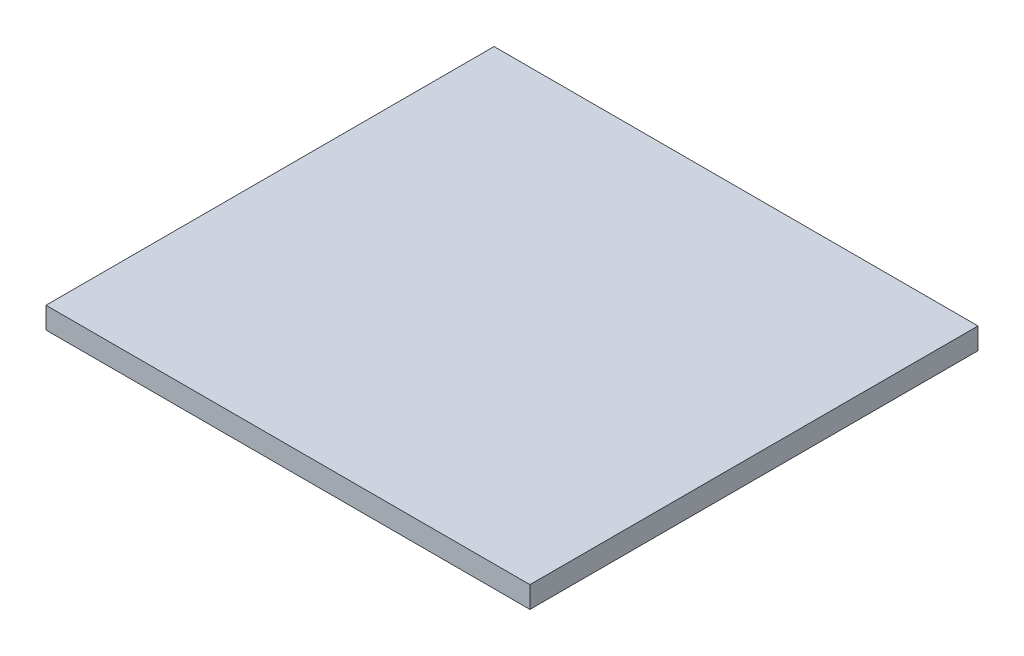
ISO-10303-21;
HEADER;
FILE_DESCRIPTION(('STEP AP214'),'2;1');
FILE_NAME('part.step','',(''),(''),'','','');
FILE_SCHEMA(('AUTOMOTIVE_DESIGN { 1 0 10303 214 1 1 1 1 }'));
ENDSEC;
DATA;
#1=APPLICATION_CONTEXT('core data for automotive mechanical design processes');
#2=APPLICATION_PROTOCOL_DEFINITION('international standard','automotive_design',2000,#1);
#3=PRODUCT_CONTEXT('',#1,'mechanical');
#4=PRODUCT('Part','Part','',(#3));
#5=PRODUCT_RELATED_PRODUCT_CATEGORY('part','',(#4));
#6=PRODUCT_DEFINITION_FORMATION('','',#4);
#7=PRODUCT_DEFINITION_CONTEXT('part definition',#1,'design');
#8=PRODUCT_DEFINITION('design','',#6,#7);
#9=PRODUCT_DEFINITION_SHAPE('','',#8);
#10=(LENGTH_UNIT() NAMED_UNIT(*) SI_UNIT(.MILLI.,.METRE.));
#11=(NAMED_UNIT(*) PLANE_ANGLE_UNIT() SI_UNIT($,.RADIAN.));
#12=(NAMED_UNIT(*) SI_UNIT($,.STERADIAN.) SOLID_ANGLE_UNIT());
#13=UNCERTAINTY_MEASURE_WITH_UNIT(LENGTH_MEASURE(1.E-05),#10,'distance_accuracy_value','');
#14=(GEOMETRIC_REPRESENTATION_CONTEXT(3) GLOBAL_UNCERTAINTY_ASSIGNED_CONTEXT((#13)) GLOBAL_UNIT_ASSIGNED_CONTEXT((#10,
#11,#12)) REPRESENTATION_CONTEXT('',''));
#15=CARTESIAN_POINT('',(0.,0.,0.));
#16=DIRECTION('',(0.,0.,1.));
#17=DIRECTION('',(1.,0.,0.));
#18=AXIS2_PLACEMENT_3D('',#15,#16,#17);
#19=CARTESIAN_POINT('',(-202.5,50.,187.5));
#20=DIRECTION('',(1.,0.,0.));
#21=DIRECTION('',(0.,0.,-1.));
#22=AXIS2_PLACEMENT_3D('',#19,#20,#21);
#23=PLANE('',#22);
#24=DIRECTION('',(0.,0.,1.));
#25=VECTOR('',#24,1.);
#26=CARTESIAN_POINT('',(-202.5,32.,187.5));
#27=LINE('',#26,#25);
#28=CARTESIAN_POINT('',(-202.5,32.,-187.5));
#29=VERTEX_POINT('',#28);
#30=CARTESIAN_POINT('',(-202.5,32.,187.5));
#31=VERTEX_POINT('',#30);
#32=EDGE_CURVE('E107',#29,#31,#27,.T.);
#33=ORIENTED_EDGE('',*,*,#32,.T.);
#34=DIRECTION('',(0.,-1.,0.));
#35=VECTOR('',#34,1.);
#36=CARTESIAN_POINT('',(-202.5,50.,187.5));
#37=LINE('',#36,#35);
#38=CARTESIAN_POINT('',(-202.5,50.,187.5));
#39=VERTEX_POINT('',#38);
#40=EDGE_CURVE('E11',#39,#31,#37,.T.);
#41=ORIENTED_EDGE('',*,*,#40,.F.);
#42=DIRECTION('',(0.,0.,1.));
#43=VECTOR('',#42,1.);
#44=CARTESIAN_POINT('',(-202.5,50.,187.5));
#45=LINE('',#44,#43);
#46=CARTESIAN_POINT('',(-202.5,50.,-187.5));
#47=VERTEX_POINT('',#46);
#48=EDGE_CURVE('E91',#47,#39,#45,.T.);
#49=ORIENTED_EDGE('',*,*,#48,.F.);
#50=DIRECTION('',(0.,-1.,0.));
#51=VECTOR('',#50,1.);
#52=CARTESIAN_POINT('',(-202.5,50.,-187.5));
#53=LINE('',#52,#51);
#54=EDGE_CURVE('E103',#47,#29,#53,.T.);
#55=ORIENTED_EDGE('',*,*,#54,.T.);
#56=EDGE_LOOP('',(#33,#41,#49,#55));
#57=FACE_BOUND('',#56,.T.);
#58=ADVANCED_FACE('F39',(#57),#23,.F.);
#59=CARTESIAN_POINT('',(-202.5,50.,187.5));
#60=DIRECTION('',(0.,0.,-1.));
#61=DIRECTION('',(-1.,0.,0.));
#62=AXIS2_PLACEMENT_3D('',#59,#60,#61);
#63=PLANE('',#62);
#64=DIRECTION('',(1.,0.,0.));
#65=VECTOR('',#64,1.);
#66=CARTESIAN_POINT('',(-202.5,32.,187.5));
#67=LINE('',#66,#65);
#68=CARTESIAN_POINT('',(202.5,32.,187.5));
#69=VERTEX_POINT('',#68);
#70=EDGE_CURVE('E96',#31,#69,#67,.T.);
#71=ORIENTED_EDGE('',*,*,#70,.T.);
#72=DIRECTION('',(0.,-1.,0.));
#73=VECTOR('',#72,1.);
#74=CARTESIAN_POINT('',(202.5,50.,187.5));
#75=LINE('',#74,#73);
#76=CARTESIAN_POINT('',(202.5,50.,187.5));
#77=VERTEX_POINT('',#76);
#78=EDGE_CURVE('E48',#77,#69,#75,.T.);
#79=ORIENTED_EDGE('',*,*,#78,.F.);
#80=DIRECTION('',(1.,0.,0.));
#81=VECTOR('',#80,1.);
#82=CARTESIAN_POINT('',(-202.5,50.,187.5));
#83=LINE('',#82,#81);
#84=EDGE_CURVE('E86',#39,#77,#83,.T.);
#85=ORIENTED_EDGE('',*,*,#84,.F.);
#86=ORIENTED_EDGE('',*,*,#40,.T.);
#87=EDGE_LOOP('',(#71,#79,#85,#86));
#88=FACE_BOUND('',#87,.T.);
#89=ADVANCED_FACE('F95',(#88),#63,.F.);
#90=CARTESIAN_POINT('',(202.5,50.,187.5));
#91=DIRECTION('',(-1.,0.,0.));
#92=DIRECTION('',(0.,0.,1.));
#93=AXIS2_PLACEMENT_3D('',#90,#91,#92);
#94=PLANE('',#93);
#95=DIRECTION('',(0.,0.,-1.));
#96=VECTOR('',#95,1.);
#97=CARTESIAN_POINT('',(202.5,32.,187.5));
#98=LINE('',#97,#96);
#99=CARTESIAN_POINT('',(202.5,32.,-187.5));
#100=VERTEX_POINT('',#99);
#101=EDGE_CURVE('E73',#69,#100,#98,.T.);
#102=ORIENTED_EDGE('',*,*,#101,.T.);
#103=DIRECTION('',(0.,-1.,0.));
#104=VECTOR('',#103,1.);
#105=CARTESIAN_POINT('',(202.5,50.,-187.5));
#106=LINE('',#105,#104);
#107=CARTESIAN_POINT('',(202.5,50.,-187.5));
#108=VERTEX_POINT('',#107);
#109=EDGE_CURVE('E98',#108,#100,#106,.T.);
#110=ORIENTED_EDGE('',*,*,#109,.F.);
#111=DIRECTION('',(0.,0.,-1.));
#112=VECTOR('',#111,1.);
#113=CARTESIAN_POINT('',(202.5,50.,187.5));
#114=LINE('',#113,#112);
#115=EDGE_CURVE('E89',#77,#108,#114,.T.);
#116=ORIENTED_EDGE('',*,*,#115,.F.);
#117=ORIENTED_EDGE('',*,*,#78,.T.);
#118=EDGE_LOOP('',(#102,#110,#116,#117));
#119=FACE_BOUND('',#118,.T.);
#120=ADVANCED_FACE('F99',(#119),#94,.F.);
#121=CARTESIAN_POINT('',(-202.5,50.,-187.5));
#122=DIRECTION('',(0.,0.,1.));
#123=DIRECTION('',(1.,0.,0.));
#124=AXIS2_PLACEMENT_3D('',#121,#122,#123);
#125=PLANE('',#124);
#126=DIRECTION('',(-1.,0.,0.));
#127=VECTOR('',#126,1.);
#128=CARTESIAN_POINT('',(-202.5,32.,-187.5));
#129=LINE('',#128,#127);
#130=EDGE_CURVE('E79',#100,#29,#129,.T.);
#131=ORIENTED_EDGE('',*,*,#130,.T.);
#132=ORIENTED_EDGE('',*,*,#54,.F.);
#133=DIRECTION('',(-1.,0.,0.));
#134=VECTOR('',#133,1.);
#135=CARTESIAN_POINT('',(-202.5,50.,-187.5));
#136=LINE('',#135,#134);
#137=EDGE_CURVE('E56',#108,#47,#136,.T.);
#138=ORIENTED_EDGE('',*,*,#137,.F.);
#139=ORIENTED_EDGE('',*,*,#109,.T.);
#140=EDGE_LOOP('',(#131,#132,#138,#139));
#141=FACE_BOUND('',#140,.T.);
#142=ADVANCED_FACE('F120',(#141),#125,.F.);
#143=CARTESIAN_POINT('',(0.,50.,0.));
#144=DIRECTION('',(0.,-1.,0.));
#145=DIRECTION('',(0.,0.,-1.));
#146=AXIS2_PLACEMENT_3D('',#143,#144,#145);
#147=PLANE('',#146);
#148=ORIENTED_EDGE('',*,*,#48,.T.);
#149=ORIENTED_EDGE('',*,*,#84,.T.);
#150=ORIENTED_EDGE('',*,*,#115,.T.);
#151=ORIENTED_EDGE('',*,*,#137,.T.);
#152=EDGE_LOOP('',(#148,#149,#150,#151));
#153=FACE_BOUND('',#152,.T.);
#154=ADVANCED_FACE('F87',(#153),#147,.F.);
#155=CARTESIAN_POINT('',(0.,32.,0.));
#156=DIRECTION('',(0.,-1.,0.));
#157=DIRECTION('',(0.,0.,-1.));
#158=AXIS2_PLACEMENT_3D('',#155,#156,#157);
#159=PLANE('',#158);
#160=ORIENTED_EDGE('',*,*,#32,.F.);
#161=ORIENTED_EDGE('',*,*,#130,.F.);
#162=ORIENTED_EDGE('',*,*,#101,.F.);
#163=ORIENTED_EDGE('',*,*,#70,.F.);
#164=EDGE_LOOP('',(#160,#161,#162,#163));
#165=FACE_BOUND('',#164,.T.);
#166=ADVANCED_FACE('F123',(#165),#159,.T.);
#167=CLOSED_SHELL('',(#58,#89,#120,#142,#154,#166));
#168=MANIFOLD_SOLID_BREP('B2',#167);
#169=ADVANCED_BREP_SHAPE_REPRESENTATION('',(#18,#168),#14);
#170=SHAPE_DEFINITION_REPRESENTATION(#9,#169);
ENDSEC;
END-ISO-10303-21;
